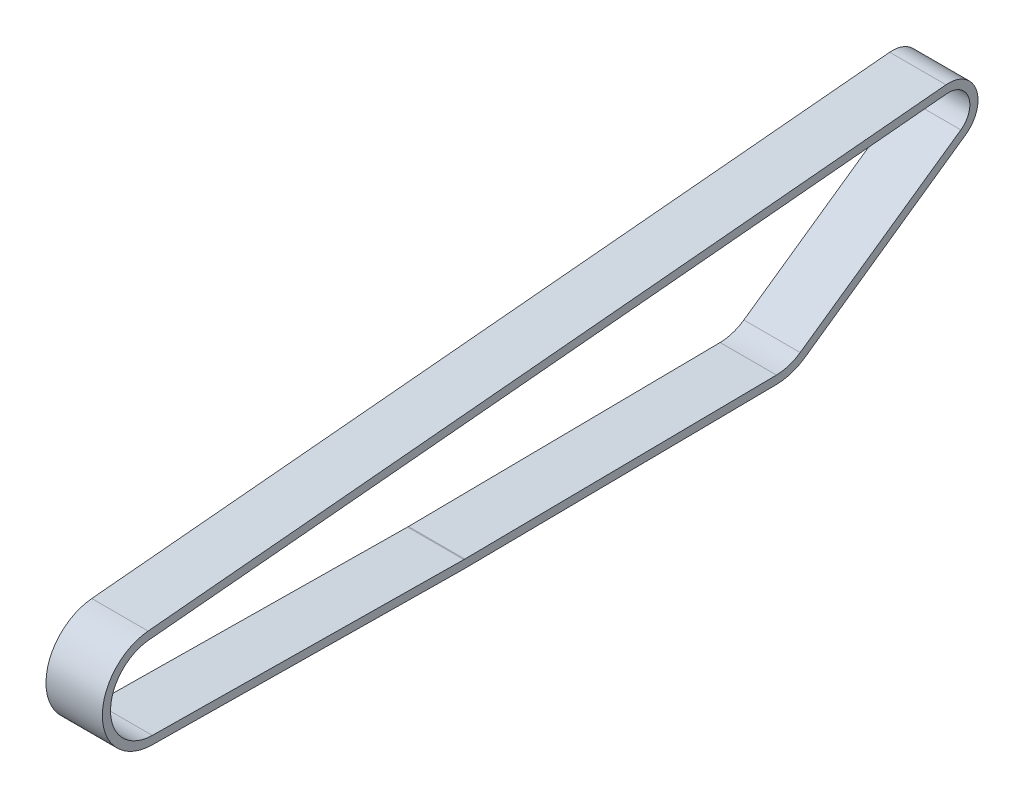
ISO-10303-21;
HEADER;
FILE_DESCRIPTION(('STEP AP214'),'2;1');
FILE_NAME('part.step','',(''),(''),'','','');
FILE_SCHEMA(('AUTOMOTIVE_DESIGN { 1 0 10303 214 1 1 1 1 }'));
ENDSEC;
DATA;
#1=APPLICATION_CONTEXT('core data for automotive mechanical design processes');
#2=APPLICATION_PROTOCOL_DEFINITION('international standard','automotive_design',2000,#1);
#3=PRODUCT_CONTEXT('',#1,'mechanical');
#4=PRODUCT('Part','Part','',(#3));
#5=PRODUCT_RELATED_PRODUCT_CATEGORY('part','',(#4));
#6=PRODUCT_DEFINITION_FORMATION('','',#4);
#7=PRODUCT_DEFINITION_CONTEXT('part definition',#1,'design');
#8=PRODUCT_DEFINITION('design','',#6,#7);
#9=PRODUCT_DEFINITION_SHAPE('','',#8);
#10=(LENGTH_UNIT() NAMED_UNIT(*) SI_UNIT(.MILLI.,.METRE.));
#11=(NAMED_UNIT(*) PLANE_ANGLE_UNIT() SI_UNIT($,.RADIAN.));
#12=(NAMED_UNIT(*) SI_UNIT($,.STERADIAN.) SOLID_ANGLE_UNIT());
#13=UNCERTAINTY_MEASURE_WITH_UNIT(LENGTH_MEASURE(1.E-05),#10,'distance_accuracy_value','');
#14=(GEOMETRIC_REPRESENTATION_CONTEXT(3) GLOBAL_UNCERTAINTY_ASSIGNED_CONTEXT((#13)) GLOBAL_UNIT_ASSIGNED_CONTEXT((#10,
#11,#12)) REPRESENTATION_CONTEXT('',''));
#15=CARTESIAN_POINT('',(0.,0.,0.));
#16=DIRECTION('',(0.,0.,1.));
#17=DIRECTION('',(1.,0.,0.));
#18=AXIS2_PLACEMENT_3D('',#15,#16,#17);
#19=CARTESIAN_POINT('',(50.8,139.781711065105,19.05));
#20=DIRECTION('',(1.,0.,0.));
#21=DIRECTION('',(0.,0.,1.));
#22=AXIS2_PLACEMENT_3D('',#19,#20,#21);
#23=PLANE('',#22);
#24=CARTESIAN_POINT('',(50.8,139.781711065105,19.05));
#25=DIRECTION('',(-1.,0.,0.));
#26=DIRECTION('',(0.,0.,1.));
#27=AXIS2_PLACEMENT_3D('',#24,#25,#26);
#28=CIRCLE('',#27,26.416);
#29=CARTESIAN_POINT('',(50.8,166.084405054826,21.4940427334818));
#30=VERTEX_POINT('',#29);
#31=CARTESIAN_POINT('',(50.8,118.142990663167,3.89840485735074));
#32=VERTEX_POINT('',#31);
#33=EDGE_CURVE('E261',#30,#32,#28,.T.);
#34=ORIENTED_EDGE('',*,*,#33,.F.);
#35=DIRECTION('',(0.,0.0925213027514316,-0.995710705243836));
#36=VECTOR('',#35,1.);
#37=CARTESIAN_POINT('',(50.8,166.084405054826,21.4940427334818));
#38=LINE('',#37,#36);
#39=CARTESIAN_POINT('',(50.8,99.2459829246163,740.806573550896));
#40=VERTEX_POINT('',#39);
#41=EDGE_CURVE('E283',#40,#30,#38,.T.);
#42=ORIENTED_EDGE('',*,*,#41,.F.);
#43=CARTESIAN_POINT('',(50.8,53.975,736.6));
#44=DIRECTION('',(-1.,0.,0.));
#45=DIRECTION('',(0.,0.,1.));
#46=AXIS2_PLACEMENT_3D('',#43,#44,#45);
#47=CIRCLE('',#46,45.466);
#48=CARTESIAN_POINT('',(50.8,8.51190409271164,737.113874035828));
#49=VERTEX_POINT('',#48);
#50=EDGE_CURVE('E280',#49,#40,#47,.T.);
#51=ORIENTED_EDGE('',*,*,#50,.F.);
#52=DIRECTION('',(0.,0.0113023805883148,0.999936126056578));
#53=VECTOR('',#52,1.);
#54=CARTESIAN_POINT('',(50.8,5.33690409271174,456.217546450482));
#55=LINE('',#54,#53);
#56=CARTESIAN_POINT('',(50.8,5.33690409271174,456.217546450482));
#57=VERTEX_POINT('',#56);
#58=EDGE_CURVE('E277',#57,#49,#55,.T.);
#59=ORIENTED_EDGE('',*,*,#58,.F.);
#60=CARTESIAN_POINT('',(50.8,50.8000000000001,455.703672414654));
#61=DIRECTION('',(-1.,0.,0.));
#62=DIRECTION('',(0.,0.,1.));
#63=AXIS2_PLACEMENT_3D('',#60,#61,#62);
#64=CIRCLE('',#63,45.466);
#65=CARTESIAN_POINT('',(50.8,5.33690409271174,455.189798378825));
#66=VERTEX_POINT('',#65);
#67=EDGE_CURVE('E274',#66,#57,#64,.T.);
#68=ORIENTED_EDGE('',*,*,#67,.F.);
#69=DIRECTION('',(0.,-0.0113023805883151,0.999936126056578));
#70=VECTOR('',#69,1.);
#71=CARTESIAN_POINT('',(50.8,8.51190409271172,174.293470793479));
#72=LINE('',#71,#70);
#73=CARTESIAN_POINT('',(50.8,8.51190409271172,174.293470793479));
#74=VERTEX_POINT('',#73);
#75=EDGE_CURVE('E271',#74,#66,#72,.T.);
#76=ORIENTED_EDGE('',*,*,#75,.F.);
#77=CARTESIAN_POINT('',(50.8,53.9750000000001,174.807344829307));
#78=DIRECTION('',(-1.,0.,0.));
#79=DIRECTION('',(0.,0.,1.));
#80=AXIS2_PLACEMENT_3D('',#77,#78,#79);
#81=CIRCLE('',#80,45.466);
#82=CARTESIAN_POINT('',(50.8,16.7314331543568,148.729118574171));
#83=VERTEX_POINT('',#82);
#84=EDGE_CURVE('E268',#83,#74,#81,.T.);
#85=ORIENTED_EDGE('',*,*,#84,.F.);
#86=DIRECTION('',(0.,-0.573576436351047,0.819152044288991));
#87=VECTOR('',#86,1.);
#88=CARTESIAN_POINT('',(50.8,118.142990663167,3.89840485735074));
#89=LINE('',#88,#87);
#90=EDGE_CURVE('E264',#32,#83,#89,.T.);
#91=ORIENTED_EDGE('',*,*,#90,.F.);
#92=EDGE_LOOP('',(#34,#42,#51,#59,#68,#76,#85,#91));
#93=FACE_BOUND('',#92,.T.);
#94=DIRECTION('',(0.,-0.573576436351047,0.819152044288991));
#95=VECTOR('',#94,1.);
#96=CARTESIAN_POINT('',(50.8,124.1768646214,8.12336888751255));
#97=LINE('',#96,#95);
#98=CARTESIAN_POINT('',(50.8,124.1768646214,8.12336888751255));
#99=VERTEX_POINT('',#98);
#100=CARTESIAN_POINT('',(50.8,22.7653071125895,152.954082604333));
#101=VERTEX_POINT('',#100);
#102=EDGE_CURVE('E209',#99,#101,#97,.T.);
#103=ORIENTED_EDGE('',*,*,#102,.T.);
#104=CARTESIAN_POINT('',(50.8,53.9750000000001,174.807344829307));
#105=DIRECTION('',(-1.,0.,0.));
#106=DIRECTION('',(0.,0.,1.));
#107=AXIS2_PLACEMENT_3D('',#104,#105,#106);
#108=CIRCLE('',#107,38.1);
#109=CARTESIAN_POINT('',(50.8,15.8774335972445,174.376724128893));
#110=VERTEX_POINT('',#109);
#111=EDGE_CURVE('E216',#101,#110,#108,.T.);
#112=ORIENTED_EDGE('',*,*,#111,.T.);
#113=DIRECTION('',(0.,-0.0113023805883151,0.999936126056578));
#114=VECTOR('',#113,1.);
#115=CARTESIAN_POINT('',(50.8,15.8774335972445,174.376724128893));
#116=LINE('',#115,#114);
#117=CARTESIAN_POINT('',(50.8,12.7024335972445,455.273051714239));
#118=VERTEX_POINT('',#117);
#119=EDGE_CURVE('E218',#110,#118,#116,.T.);
#120=ORIENTED_EDGE('',*,*,#119,.T.);
#121=CARTESIAN_POINT('',(50.8,50.8000000000001,455.703672414654));
#122=DIRECTION('',(-1.,0.,0.));
#123=DIRECTION('',(0.,0.,1.));
#124=AXIS2_PLACEMENT_3D('',#121,#122,#123);
#125=CIRCLE('',#124,38.1);
#126=CARTESIAN_POINT('',(50.8,12.7024335972445,456.134293115069));
#127=VERTEX_POINT('',#126);
#128=EDGE_CURVE('E223',#118,#127,#125,.T.);
#129=ORIENTED_EDGE('',*,*,#128,.T.);
#130=DIRECTION('',(0.,0.0113023805883148,0.999936126056578));
#131=VECTOR('',#130,1.);
#132=CARTESIAN_POINT('',(50.8,12.7024335972445,456.134293115069));
#133=LINE('',#132,#131);
#134=CARTESIAN_POINT('',(50.8,15.8774335972444,737.030620700415));
#135=VERTEX_POINT('',#134);
#136=EDGE_CURVE('E226',#127,#135,#133,.T.);
#137=ORIENTED_EDGE('',*,*,#136,.T.);
#138=CARTESIAN_POINT('',(50.8,53.975,736.6));
#139=DIRECTION('',(-1.,0.,0.));
#140=DIRECTION('',(0.,0.,1.));
#141=AXIS2_PLACEMENT_3D('',#138,#139,#140);
#142=CIRCLE('',#141,38.1);
#143=CARTESIAN_POINT('',(50.8,91.9115778697902,740.12506163483));
#144=VERTEX_POINT('',#143);
#145=EDGE_CURVE('E229',#135,#144,#142,.T.);
#146=ORIENTED_EDGE('',*,*,#145,.T.);
#147=DIRECTION('',(0.,0.0925213027514316,-0.995710705243836));
#148=VECTOR('',#147,1.);
#149=CARTESIAN_POINT('',(50.8,158.75,20.8125308174148));
#150=LINE('',#149,#148);
#151=CARTESIAN_POINT('',(50.8,158.75,20.8125308174148));
#152=VERTEX_POINT('',#151);
#153=EDGE_CURVE('E211',#144,#152,#150,.T.);
#154=ORIENTED_EDGE('',*,*,#153,.T.);
#155=CARTESIAN_POINT('',(50.8,139.781711065105,19.05));
#156=DIRECTION('',(-1.,0.,0.));
#157=DIRECTION('',(0.,0.,1.));
#158=AXIS2_PLACEMENT_3D('',#155,#156,#157);
#159=CIRCLE('',#158,19.05);
#160=EDGE_CURVE('E195',#152,#99,#159,.T.);
#161=ORIENTED_EDGE('',*,*,#160,.T.);
#162=EDGE_LOOP('',(#103,#112,#120,#129,#137,#146,#154,#161));
#163=FACE_BOUND('',#162,.T.);
#164=ADVANCED_FACE('F81',(#93,#163),#23,.T.);
#165=CARTESIAN_POINT('',(0.,139.781711065105,19.05));
#166=DIRECTION('',(1.,0.,0.));
#167=DIRECTION('',(0.,0.,1.));
#168=AXIS2_PLACEMENT_3D('',#165,#166,#167);
#169=PLANE('',#168);
#170=CARTESIAN_POINT('',(0.,139.781711065105,19.05));
#171=DIRECTION('',(-1.,0.,0.));
#172=DIRECTION('',(0.,0.,1.));
#173=AXIS2_PLACEMENT_3D('',#170,#171,#172);
#174=CIRCLE('',#173,26.416);
#175=CARTESIAN_POINT('',(0.,166.084405054826,21.4940427334818));
#176=VERTEX_POINT('',#175);
#177=CARTESIAN_POINT('',(0.,118.142990663167,3.89840485735074));
#178=VERTEX_POINT('',#177);
#179=EDGE_CURVE('E203',#176,#178,#174,.T.);
#180=ORIENTED_EDGE('',*,*,#179,.T.);
#181=DIRECTION('',(0.,-0.573576436351047,0.819152044288991));
#182=VECTOR('',#181,1.);
#183=CARTESIAN_POINT('',(0.,118.142990663167,3.89840485735074));
#184=LINE('',#183,#182);
#185=CARTESIAN_POINT('',(0.,16.7314331543568,148.729118574171));
#186=VERTEX_POINT('',#185);
#187=EDGE_CURVE('E289',#178,#186,#184,.T.);
#188=ORIENTED_EDGE('',*,*,#187,.T.);
#189=CARTESIAN_POINT('',(0.,53.9750000000001,174.807344829307));
#190=DIRECTION('',(-1.,0.,0.));
#191=DIRECTION('',(0.,0.,1.));
#192=AXIS2_PLACEMENT_3D('',#189,#190,#191);
#193=CIRCLE('',#192,45.466);
#194=CARTESIAN_POINT('',(0.,8.51190409271172,174.293470793479));
#195=VERTEX_POINT('',#194);
#196=EDGE_CURVE('E292',#186,#195,#193,.T.);
#197=ORIENTED_EDGE('',*,*,#196,.T.);
#198=DIRECTION('',(0.,-0.0113023805883151,0.999936126056578));
#199=VECTOR('',#198,1.);
#200=CARTESIAN_POINT('',(0.,8.51190409271172,174.293470793479));
#201=LINE('',#200,#199);
#202=CARTESIAN_POINT('',(0.,5.33690409271174,455.189798378825));
#203=VERTEX_POINT('',#202);
#204=EDGE_CURVE('E295',#195,#203,#201,.T.);
#205=ORIENTED_EDGE('',*,*,#204,.T.);
#206=CARTESIAN_POINT('',(0.,50.8000000000001,455.703672414654));
#207=DIRECTION('',(-1.,0.,0.));
#208=DIRECTION('',(0.,0.,1.));
#209=AXIS2_PLACEMENT_3D('',#206,#207,#208);
#210=CIRCLE('',#209,45.466);
#211=CARTESIAN_POINT('',(0.,5.33690409271174,456.217546450482));
#212=VERTEX_POINT('',#211);
#213=EDGE_CURVE('E298',#203,#212,#210,.T.);
#214=ORIENTED_EDGE('',*,*,#213,.T.);
#215=DIRECTION('',(0.,0.0113023805883148,0.999936126056578));
#216=VECTOR('',#215,1.);
#217=CARTESIAN_POINT('',(0.,5.33690409271174,456.217546450482));
#218=LINE('',#217,#216);
#219=CARTESIAN_POINT('',(0.,8.51190409271164,737.113874035828));
#220=VERTEX_POINT('',#219);
#221=EDGE_CURVE('E301',#212,#220,#218,.T.);
#222=ORIENTED_EDGE('',*,*,#221,.T.);
#223=CARTESIAN_POINT('',(0.,53.975,736.6));
#224=DIRECTION('',(-1.,0.,0.));
#225=DIRECTION('',(0.,0.,1.));
#226=AXIS2_PLACEMENT_3D('',#223,#224,#225);
#227=CIRCLE('',#226,45.466);
#228=CARTESIAN_POINT('',(0.,99.2459829246163,740.806573550896));
#229=VERTEX_POINT('',#228);
#230=EDGE_CURVE('E304',#220,#229,#227,.T.);
#231=ORIENTED_EDGE('',*,*,#230,.T.);
#232=DIRECTION('',(0.,0.0925213027514316,-0.995710705243836));
#233=VECTOR('',#232,1.);
#234=CARTESIAN_POINT('',(0.,166.084405054826,21.4940427334818));
#235=LINE('',#234,#233);
#236=EDGE_CURVE('E265',#229,#176,#235,.T.);
#237=ORIENTED_EDGE('',*,*,#236,.T.);
#238=EDGE_LOOP('',(#180,#188,#197,#205,#214,#222,#231,#237));
#239=FACE_BOUND('',#238,.T.);
#240=CARTESIAN_POINT('',(0.,139.781711065105,19.05));
#241=DIRECTION('',(-1.,0.,0.));
#242=DIRECTION('',(0.,0.,1.));
#243=AXIS2_PLACEMENT_3D('',#240,#241,#242);
#244=CIRCLE('',#243,19.05);
#245=CARTESIAN_POINT('',(0.,158.75,20.8125308174148));
#246=VERTEX_POINT('',#245);
#247=CARTESIAN_POINT('',(0.,124.1768646214,8.12336888751255));
#248=VERTEX_POINT('',#247);
#249=EDGE_CURVE('E198',#246,#248,#244,.T.);
#250=ORIENTED_EDGE('',*,*,#249,.F.);
#251=DIRECTION('',(0.,0.0925213027514316,-0.995710705243836));
#252=VECTOR('',#251,1.);
#253=CARTESIAN_POINT('',(0.,158.75,20.8125308174148));
#254=LINE('',#253,#252);
#255=CARTESIAN_POINT('',(0.,91.9115778697902,740.12506163483));
#256=VERTEX_POINT('',#255);
#257=EDGE_CURVE('E212',#256,#246,#254,.T.);
#258=ORIENTED_EDGE('',*,*,#257,.F.);
#259=CARTESIAN_POINT('',(0.,53.975,736.6));
#260=DIRECTION('',(-1.,0.,0.));
#261=DIRECTION('',(0.,0.,1.));
#262=AXIS2_PLACEMENT_3D('',#259,#260,#261);
#263=CIRCLE('',#262,38.1);
#264=CARTESIAN_POINT('',(0.,15.8774335972444,737.030620700415));
#265=VERTEX_POINT('',#264);
#266=EDGE_CURVE('E247',#265,#256,#263,.T.);
#267=ORIENTED_EDGE('',*,*,#266,.F.);
#268=DIRECTION('',(0.,0.0113023805883148,0.999936126056578));
#269=VECTOR('',#268,1.);
#270=CARTESIAN_POINT('',(0.,12.7024335972445,456.134293115069));
#271=LINE('',#270,#269);
#272=CARTESIAN_POINT('',(0.,12.7024335972445,456.134293115069));
#273=VERTEX_POINT('',#272);
#274=EDGE_CURVE('E244',#273,#265,#271,.T.);
#275=ORIENTED_EDGE('',*,*,#274,.F.);
#276=CARTESIAN_POINT('',(0.,50.8000000000001,455.703672414654));
#277=DIRECTION('',(-1.,0.,0.));
#278=DIRECTION('',(0.,0.,1.));
#279=AXIS2_PLACEMENT_3D('',#276,#277,#278);
#280=CIRCLE('',#279,38.1);
#281=CARTESIAN_POINT('',(0.,12.7024335972445,455.273051714239));
#282=VERTEX_POINT('',#281);
#283=EDGE_CURVE('E241',#282,#273,#280,.T.);
#284=ORIENTED_EDGE('',*,*,#283,.F.);
#285=DIRECTION('',(0.,-0.0113023805883151,0.999936126056578));
#286=VECTOR('',#285,1.);
#287=CARTESIAN_POINT('',(0.,15.8774335972445,174.376724128893));
#288=LINE('',#287,#286);
#289=CARTESIAN_POINT('',(0.,15.8774335972445,174.376724128893));
#290=VERTEX_POINT('',#289);
#291=EDGE_CURVE('E238',#290,#282,#288,.T.);
#292=ORIENTED_EDGE('',*,*,#291,.F.);
#293=CARTESIAN_POINT('',(0.,53.9750000000001,174.807344829307));
#294=DIRECTION('',(-1.,0.,0.));
#295=DIRECTION('',(0.,0.,1.));
#296=AXIS2_PLACEMENT_3D('',#293,#294,#295);
#297=CIRCLE('',#296,38.1);
#298=CARTESIAN_POINT('',(0.,22.7653071125895,152.954082604333));
#299=VERTEX_POINT('',#298);
#300=EDGE_CURVE('E235',#299,#290,#297,.T.);
#301=ORIENTED_EDGE('',*,*,#300,.F.);
#302=DIRECTION('',(0.,-0.573576436351047,0.819152044288991));
#303=VECTOR('',#302,1.);
#304=CARTESIAN_POINT('',(0.,124.1768646214,8.12336888751255));
#305=LINE('',#304,#303);
#306=EDGE_CURVE('E233',#248,#299,#305,.T.);
#307=ORIENTED_EDGE('',*,*,#306,.F.);
#308=EDGE_LOOP('',(#250,#258,#267,#275,#284,#292,#301,#307));
#309=FACE_BOUND('',#308,.T.);
#310=ADVANCED_FACE('F329',(#239,#309),#169,.F.);
#311=CARTESIAN_POINT('',(50.8,139.781711065105,19.05));
#312=DIRECTION('',(-1.,0.,0.));
#313=DIRECTION('',(0.,0.,-1.));
#314=AXIS2_PLACEMENT_3D('',#311,#312,#313);
#315=CYLINDRICAL_SURFACE('',#314,26.416);
#316=ORIENTED_EDGE('',*,*,#179,.F.);
#317=DIRECTION('',(-1.,0.,0.));
#318=VECTOR('',#317,1.);
#319=CARTESIAN_POINT('',(50.8,166.084405054826,21.4940427334818));
#320=LINE('',#319,#318);
#321=EDGE_CURVE('E286',#30,#176,#320,.T.);
#322=ORIENTED_EDGE('',*,*,#321,.F.);
#323=ORIENTED_EDGE('',*,*,#33,.T.);
#324=DIRECTION('',(-1.,0.,0.));
#325=VECTOR('',#324,1.);
#326=CARTESIAN_POINT('',(50.8,118.142990663167,3.89840485735074));
#327=LINE('',#326,#325);
#328=EDGE_CURVE('E12',#32,#178,#327,.T.);
#329=ORIENTED_EDGE('',*,*,#328,.T.);
#330=EDGE_LOOP('',(#316,#322,#323,#329));
#331=FACE_BOUND('',#330,.T.);
#332=ADVANCED_FACE('F83',(#331),#315,.T.);
#333=CARTESIAN_POINT('',(50.8,118.142990663167,3.89840485735074));
#334=DIRECTION('',(0.,0.819152044288991,0.573576436351047));
#335=DIRECTION('',(0.,0.573576436351047,-0.819152044288991));
#336=AXIS2_PLACEMENT_3D('',#333,#334,#335);
#337=PLANE('',#336);
#338=ORIENTED_EDGE('',*,*,#187,.F.);
#339=ORIENTED_EDGE('',*,*,#328,.F.);
#340=ORIENTED_EDGE('',*,*,#90,.T.);
#341=DIRECTION('',(-1.,0.,0.));
#342=VECTOR('',#341,1.);
#343=CARTESIAN_POINT('',(50.8,16.7314331543568,148.729118574171));
#344=LINE('',#343,#342);
#345=EDGE_CURVE('E89',#83,#186,#344,.T.);
#346=ORIENTED_EDGE('',*,*,#345,.T.);
#347=EDGE_LOOP('',(#338,#339,#340,#346));
#348=FACE_BOUND('',#347,.T.);
#349=ADVANCED_FACE('F322',(#348),#337,.F.);
#350=CARTESIAN_POINT('',(50.8,53.9750000000001,174.807344829307));
#351=DIRECTION('',(-1.,0.,0.));
#352=DIRECTION('',(0.,0.,-1.));
#353=AXIS2_PLACEMENT_3D('',#350,#351,#352);
#354=CYLINDRICAL_SURFACE('',#353,45.466);
#355=ORIENTED_EDGE('',*,*,#196,.F.);
#356=ORIENTED_EDGE('',*,*,#345,.F.);
#357=ORIENTED_EDGE('',*,*,#84,.T.);
#358=DIRECTION('',(-1.,0.,0.));
#359=VECTOR('',#358,1.);
#360=CARTESIAN_POINT('',(50.8,8.51190409271172,174.293470793479));
#361=LINE('',#360,#359);
#362=EDGE_CURVE('E318',#74,#195,#361,.T.);
#363=ORIENTED_EDGE('',*,*,#362,.T.);
#364=EDGE_LOOP('',(#355,#356,#357,#363));
#365=FACE_BOUND('',#364,.T.);
#366=ADVANCED_FACE('F326',(#365),#354,.T.);
#367=CARTESIAN_POINT('',(50.8,8.51190409271172,174.293470793479));
#368=DIRECTION('',(0.,0.999936126056578,0.0113023805883151));
#369=DIRECTION('',(0.,0.0113023805883151,-0.999936126056578));
#370=AXIS2_PLACEMENT_3D('',#367,#368,#369);
#371=PLANE('',#370);
#372=ORIENTED_EDGE('',*,*,#204,.F.);
#373=ORIENTED_EDGE('',*,*,#362,.F.);
#374=ORIENTED_EDGE('',*,*,#75,.T.);
#375=DIRECTION('',(-1.,0.,0.));
#376=VECTOR('',#375,1.);
#377=CARTESIAN_POINT('',(50.8,5.33690409271174,455.189798378825));
#378=LINE('',#377,#376);
#379=EDGE_CURVE('E316',#66,#203,#378,.T.);
#380=ORIENTED_EDGE('',*,*,#379,.T.);
#381=EDGE_LOOP('',(#372,#373,#374,#380));
#382=FACE_BOUND('',#381,.T.);
#383=ADVANCED_FACE('F341',(#382),#371,.F.);
#384=CARTESIAN_POINT('',(50.8,50.8000000000001,455.703672414654));
#385=DIRECTION('',(-1.,0.,0.));
#386=DIRECTION('',(0.,0.,-1.));
#387=AXIS2_PLACEMENT_3D('',#384,#385,#386);
#388=CYLINDRICAL_SURFACE('',#387,45.466);
#389=ORIENTED_EDGE('',*,*,#213,.F.);
#390=ORIENTED_EDGE('',*,*,#379,.F.);
#391=ORIENTED_EDGE('',*,*,#67,.T.);
#392=DIRECTION('',(-1.,0.,0.));
#393=VECTOR('',#392,1.);
#394=CARTESIAN_POINT('',(50.8,5.33690409271174,456.217546450482));
#395=LINE('',#394,#393);
#396=EDGE_CURVE('E314',#57,#212,#395,.T.);
#397=ORIENTED_EDGE('',*,*,#396,.T.);
#398=EDGE_LOOP('',(#389,#390,#391,#397));
#399=FACE_BOUND('',#398,.T.);
#400=ADVANCED_FACE('F345',(#399),#388,.T.);
#401=CARTESIAN_POINT('',(50.8,5.33690409271174,456.217546450482));
#402=DIRECTION('',(0.,0.999936126056578,-0.0113023805883148));
#403=DIRECTION('',(0.,-0.0113023805883148,-0.999936126056578));
#404=AXIS2_PLACEMENT_3D('',#401,#402,#403);
#405=PLANE('',#404);
#406=ORIENTED_EDGE('',*,*,#221,.F.);
#407=ORIENTED_EDGE('',*,*,#396,.F.);
#408=ORIENTED_EDGE('',*,*,#58,.T.);
#409=DIRECTION('',(-1.,0.,0.));
#410=VECTOR('',#409,1.);
#411=CARTESIAN_POINT('',(50.8,8.51190409271164,737.113874035828));
#412=LINE('',#411,#410);
#413=EDGE_CURVE('E312',#49,#220,#412,.T.);
#414=ORIENTED_EDGE('',*,*,#413,.T.);
#415=EDGE_LOOP('',(#406,#407,#408,#414));
#416=FACE_BOUND('',#415,.T.);
#417=ADVANCED_FACE('F347',(#416),#405,.F.);
#418=CARTESIAN_POINT('',(50.8,53.975,736.6));
#419=DIRECTION('',(-1.,0.,0.));
#420=DIRECTION('',(0.,0.,-1.));
#421=AXIS2_PLACEMENT_3D('',#418,#419,#420);
#422=CYLINDRICAL_SURFACE('',#421,45.466);
#423=ORIENTED_EDGE('',*,*,#230,.F.);
#424=ORIENTED_EDGE('',*,*,#413,.F.);
#425=ORIENTED_EDGE('',*,*,#50,.T.);
#426=DIRECTION('',(-1.,0.,0.));
#427=VECTOR('',#426,1.);
#428=CARTESIAN_POINT('',(50.8,99.2459829246163,740.806573550896));
#429=LINE('',#428,#427);
#430=EDGE_CURVE('E310',#40,#229,#429,.T.);
#431=ORIENTED_EDGE('',*,*,#430,.T.);
#432=EDGE_LOOP('',(#423,#424,#425,#431));
#433=FACE_BOUND('',#432,.T.);
#434=ADVANCED_FACE('F351',(#433),#422,.T.);
#435=CARTESIAN_POINT('',(50.8,166.084405054826,21.4940427334818));
#436=DIRECTION('',(0.,-0.995710705243836,-0.0925213027514316));
#437=DIRECTION('',(0.,-0.0925213027514316,0.995710705243837));
#438=AXIS2_PLACEMENT_3D('',#435,#436,#437);
#439=PLANE('',#438);
#440=ORIENTED_EDGE('',*,*,#236,.F.);
#441=ORIENTED_EDGE('',*,*,#430,.F.);
#442=ORIENTED_EDGE('',*,*,#41,.T.);
#443=ORIENTED_EDGE('',*,*,#321,.T.);
#444=EDGE_LOOP('',(#440,#441,#442,#443));
#445=FACE_BOUND('',#444,.T.);
#446=ADVANCED_FACE('F353',(#445),#439,.F.);
#447=CARTESIAN_POINT('',(50.8,139.781711065105,19.05));
#448=DIRECTION('',(-1.,0.,0.));
#449=DIRECTION('',(0.,0.,-1.));
#450=AXIS2_PLACEMENT_3D('',#447,#448,#449);
#451=CYLINDRICAL_SURFACE('',#450,19.05);
#452=ORIENTED_EDGE('',*,*,#249,.T.);
#453=DIRECTION('',(-1.,0.,0.));
#454=VECTOR('',#453,1.);
#455=CARTESIAN_POINT('',(50.8,124.1768646214,8.12336888751255));
#456=LINE('',#455,#454);
#457=EDGE_CURVE('E192',#99,#248,#456,.T.);
#458=ORIENTED_EDGE('',*,*,#457,.F.);
#459=ORIENTED_EDGE('',*,*,#160,.F.);
#460=DIRECTION('',(-1.,0.,0.));
#461=VECTOR('',#460,1.);
#462=CARTESIAN_POINT('',(50.8,158.75,20.8125308174148));
#463=LINE('',#462,#461);
#464=EDGE_CURVE('E104',#152,#246,#463,.T.);
#465=ORIENTED_EDGE('',*,*,#464,.T.);
#466=EDGE_LOOP('',(#452,#458,#459,#465));
#467=FACE_BOUND('',#466,.T.);
#468=ADVANCED_FACE('F194',(#467),#451,.F.);
#469=CARTESIAN_POINT('',(50.8,124.1768646214,8.12336888751255));
#470=DIRECTION('',(0.,0.819152044288991,0.573576436351047));
#471=DIRECTION('',(0.,0.573576436351047,-0.819152044288991));
#472=AXIS2_PLACEMENT_3D('',#469,#470,#471);
#473=PLANE('',#472);
#474=ORIENTED_EDGE('',*,*,#306,.T.);
#475=DIRECTION('',(-1.,0.,0.));
#476=VECTOR('',#475,1.);
#477=CARTESIAN_POINT('',(50.8,22.7653071125895,152.954082604333));
#478=LINE('',#477,#476);
#479=EDGE_CURVE('E204',#101,#299,#478,.T.);
#480=ORIENTED_EDGE('',*,*,#479,.F.);
#481=ORIENTED_EDGE('',*,*,#102,.F.);
#482=ORIENTED_EDGE('',*,*,#457,.T.);
#483=EDGE_LOOP('',(#474,#480,#481,#482));
#484=FACE_BOUND('',#483,.T.);
#485=ADVANCED_FACE('F214',(#484),#473,.T.);
#486=CARTESIAN_POINT('',(50.8,53.9750000000001,174.807344829307));
#487=DIRECTION('',(-1.,0.,0.));
#488=DIRECTION('',(0.,0.,-1.));
#489=AXIS2_PLACEMENT_3D('',#486,#487,#488);
#490=CYLINDRICAL_SURFACE('',#489,38.1);
#491=ORIENTED_EDGE('',*,*,#300,.T.);
#492=DIRECTION('',(-1.,0.,0.));
#493=VECTOR('',#492,1.);
#494=CARTESIAN_POINT('',(50.8,15.8774335972445,174.376724128893));
#495=LINE('',#494,#493);
#496=EDGE_CURVE('E258',#110,#290,#495,.T.);
#497=ORIENTED_EDGE('',*,*,#496,.F.);
#498=ORIENTED_EDGE('',*,*,#111,.F.);
#499=ORIENTED_EDGE('',*,*,#479,.T.);
#500=EDGE_LOOP('',(#491,#497,#498,#499));
#501=FACE_BOUND('',#500,.T.);
#502=ADVANCED_FACE('F371',(#501),#490,.F.);
#503=CARTESIAN_POINT('',(50.8,15.8774335972445,174.376724128893));
#504=DIRECTION('',(0.,0.999936126056578,0.0113023805883151));
#505=DIRECTION('',(0.,0.0113023805883151,-0.999936126056578));
#506=AXIS2_PLACEMENT_3D('',#503,#504,#505);
#507=PLANE('',#506);
#508=ORIENTED_EDGE('',*,*,#291,.T.);
#509=DIRECTION('',(-1.,0.,0.));
#510=VECTOR('',#509,1.);
#511=CARTESIAN_POINT('',(50.8,12.7024335972445,455.273051714239));
#512=LINE('',#511,#510);
#513=EDGE_CURVE('E256',#118,#282,#512,.T.);
#514=ORIENTED_EDGE('',*,*,#513,.F.);
#515=ORIENTED_EDGE('',*,*,#119,.F.);
#516=ORIENTED_EDGE('',*,*,#496,.T.);
#517=EDGE_LOOP('',(#508,#514,#515,#516));
#518=FACE_BOUND('',#517,.T.);
#519=ADVANCED_FACE('F374',(#518),#507,.T.);
#520=CARTESIAN_POINT('',(50.8,50.8000000000001,455.703672414654));
#521=DIRECTION('',(-1.,0.,0.));
#522=DIRECTION('',(0.,0.,-1.));
#523=AXIS2_PLACEMENT_3D('',#520,#521,#522);
#524=CYLINDRICAL_SURFACE('',#523,38.1);
#525=ORIENTED_EDGE('',*,*,#283,.T.);
#526=DIRECTION('',(-1.,0.,0.));
#527=VECTOR('',#526,1.);
#528=CARTESIAN_POINT('',(50.8,12.7024335972445,456.134293115069));
#529=LINE('',#528,#527);
#530=EDGE_CURVE('E254',#127,#273,#529,.T.);
#531=ORIENTED_EDGE('',*,*,#530,.F.);
#532=ORIENTED_EDGE('',*,*,#128,.F.);
#533=ORIENTED_EDGE('',*,*,#513,.T.);
#534=EDGE_LOOP('',(#525,#531,#532,#533));
#535=FACE_BOUND('',#534,.T.);
#536=ADVANCED_FACE('F378',(#535),#524,.F.);
#537=CARTESIAN_POINT('',(50.8,12.7024335972445,456.134293115069));
#538=DIRECTION('',(0.,0.999936126056578,-0.0113023805883148));
#539=DIRECTION('',(0.,-0.0113023805883148,-0.999936126056578));
#540=AXIS2_PLACEMENT_3D('',#537,#538,#539);
#541=PLANE('',#540);
#542=ORIENTED_EDGE('',*,*,#274,.T.);
#543=DIRECTION('',(-1.,0.,0.));
#544=VECTOR('',#543,1.);
#545=CARTESIAN_POINT('',(50.8,15.8774335972444,737.030620700415));
#546=LINE('',#545,#544);
#547=EDGE_CURVE('E252',#135,#265,#546,.T.);
#548=ORIENTED_EDGE('',*,*,#547,.F.);
#549=ORIENTED_EDGE('',*,*,#136,.F.);
#550=ORIENTED_EDGE('',*,*,#530,.T.);
#551=EDGE_LOOP('',(#542,#548,#549,#550));
#552=FACE_BOUND('',#551,.T.);
#553=ADVANCED_FACE('F382',(#552),#541,.T.);
#554=CARTESIAN_POINT('',(50.8,53.975,736.6));
#555=DIRECTION('',(-1.,0.,0.));
#556=DIRECTION('',(0.,0.,-1.));
#557=AXIS2_PLACEMENT_3D('',#554,#555,#556);
#558=CYLINDRICAL_SURFACE('',#557,38.1);
#559=ORIENTED_EDGE('',*,*,#266,.T.);
#560=DIRECTION('',(-1.,0.,0.));
#561=VECTOR('',#560,1.);
#562=CARTESIAN_POINT('',(50.8,91.9115778697902,740.12506163483));
#563=LINE('',#562,#561);
#564=EDGE_CURVE('E96',#144,#256,#563,.T.);
#565=ORIENTED_EDGE('',*,*,#564,.F.);
#566=ORIENTED_EDGE('',*,*,#145,.F.);
#567=ORIENTED_EDGE('',*,*,#547,.T.);
#568=EDGE_LOOP('',(#559,#565,#566,#567));
#569=FACE_BOUND('',#568,.T.);
#570=ADVANCED_FACE('F386',(#569),#558,.F.);
#571=CARTESIAN_POINT('',(50.8,158.75,20.8125308174148));
#572=DIRECTION('',(0.,-0.995710705243836,-0.0925213027514316));
#573=DIRECTION('',(0.,-0.0925213027514316,0.995710705243837));
#574=AXIS2_PLACEMENT_3D('',#571,#572,#573);
#575=PLANE('',#574);
#576=ORIENTED_EDGE('',*,*,#257,.T.);
#577=ORIENTED_EDGE('',*,*,#464,.F.);
#578=ORIENTED_EDGE('',*,*,#153,.F.);
#579=ORIENTED_EDGE('',*,*,#564,.T.);
#580=EDGE_LOOP('',(#576,#577,#578,#579));
#581=FACE_BOUND('',#580,.T.);
#582=ADVANCED_FACE('F390',(#581),#575,.T.);
#583=CLOSED_SHELL('',(#164,#310,#332,#349,#366,#383,#400,#417,#434,#446,#468,#485,#502,#519,
#536,#553,#570,#582));
#584=MANIFOLD_SOLID_BREP('B2',#583);
#585=ADVANCED_BREP_SHAPE_REPRESENTATION('',(#18,#584),#14);
#586=SHAPE_DEFINITION_REPRESENTATION(#9,#585);
ENDSEC;
END-ISO-10303-21;
